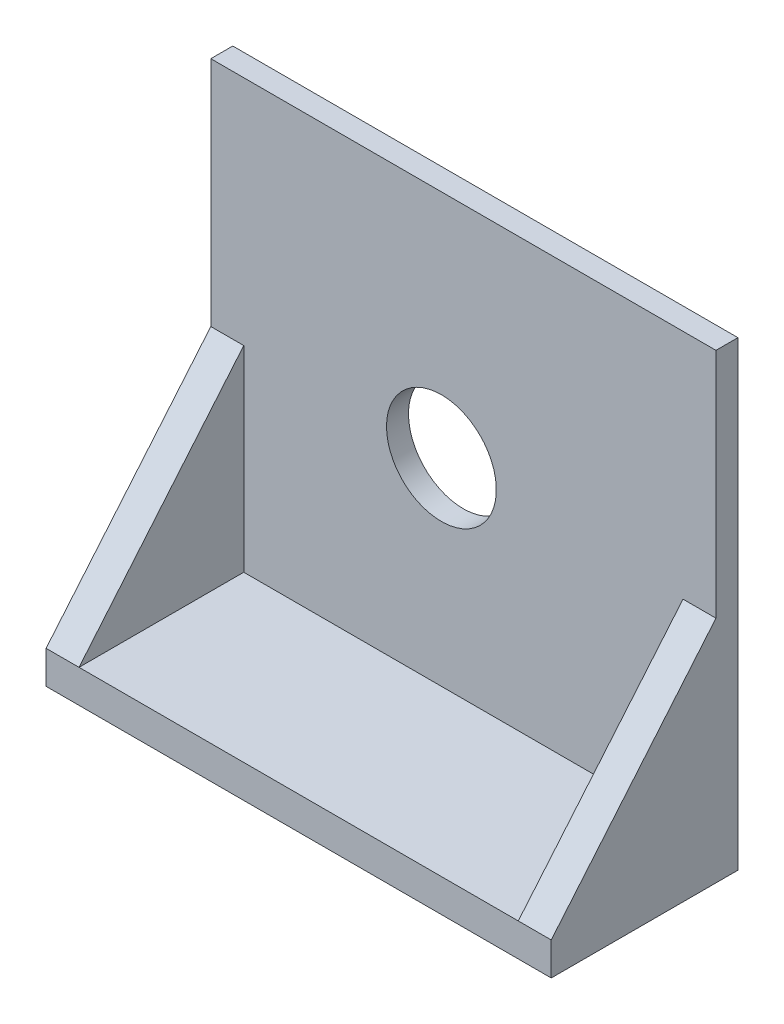
ISO-10303-21;
HEADER;
FILE_DESCRIPTION(('STEP AP214'),'2;1');
FILE_NAME('part.step','',(''),(''),'','','');
FILE_SCHEMA(('AUTOMOTIVE_DESIGN { 1 0 10303 214 1 1 1 1 }'));
ENDSEC;
DATA;
#1=APPLICATION_CONTEXT('core data for automotive mechanical design processes');
#2=APPLICATION_PROTOCOL_DEFINITION('international standard','automotive_design',2000,#1);
#3=PRODUCT_CONTEXT('',#1,'mechanical');
#4=PRODUCT('Part','Part','',(#3));
#5=PRODUCT_RELATED_PRODUCT_CATEGORY('part','',(#4));
#6=PRODUCT_DEFINITION_FORMATION('','',#4);
#7=PRODUCT_DEFINITION_CONTEXT('part definition',#1,'design');
#8=PRODUCT_DEFINITION('design','',#6,#7);
#9=PRODUCT_DEFINITION_SHAPE('','',#8);
#10=(LENGTH_UNIT() NAMED_UNIT(*) SI_UNIT(.MILLI.,.METRE.));
#11=(NAMED_UNIT(*) PLANE_ANGLE_UNIT() SI_UNIT($,.RADIAN.));
#12=(NAMED_UNIT(*) SI_UNIT($,.STERADIAN.) SOLID_ANGLE_UNIT());
#13=UNCERTAINTY_MEASURE_WITH_UNIT(LENGTH_MEASURE(1.E-05),#10,'distance_accuracy_value','');
#14=(GEOMETRIC_REPRESENTATION_CONTEXT(3) GLOBAL_UNCERTAINTY_ASSIGNED_CONTEXT((#13)) GLOBAL_UNIT_ASSIGNED_CONTEXT((#10,
#11,#12)) REPRESENTATION_CONTEXT('',''));
#15=CARTESIAN_POINT('',(0.,0.,0.));
#16=DIRECTION('',(0.,0.,1.));
#17=DIRECTION('',(1.,0.,0.));
#18=AXIS2_PLACEMENT_3D('',#15,#16,#17);
#19=CARTESIAN_POINT('',(0.,-39.,17.));
#20=DIRECTION('',(0.,-1.,0.));
#21=DIRECTION('',(0.,0.,-1.));
#22=AXIS2_PLACEMENT_3D('',#19,#20,#21);
#23=PLANE('',#22);
#24=DIRECTION('',(0.,0.,-1.));
#25=VECTOR('',#24,1.);
#26=CARTESIAN_POINT('',(43.,-39.,2.));
#27=LINE('',#26,#25);
#28=CARTESIAN_POINT('',(43.,-39.,17.));
#29=VERTEX_POINT('',#28);
#30=CARTESIAN_POINT('',(43.,-39.,2.));
#31=VERTEX_POINT('',#30);
#32=EDGE_CURVE('E230',#29,#31,#27,.T.);
#33=ORIENTED_EDGE('',*,*,#32,.T.);
#34=DIRECTION('',(-1.,0.,0.));
#35=VECTOR('',#34,1.);
#36=CARTESIAN_POINT('',(0.,-39.,2.));
#37=LINE('',#36,#35);
#38=CARTESIAN_POINT('',(3.,-39.,2.));
#39=VERTEX_POINT('',#38);
#40=EDGE_CURVE('E135',#31,#39,#37,.T.);
#41=ORIENTED_EDGE('',*,*,#40,.T.);
#42=DIRECTION('',(0.,0.,1.));
#43=VECTOR('',#42,1.);
#44=CARTESIAN_POINT('',(3.,-39.,17.));
#45=LINE('',#44,#43);
#46=CARTESIAN_POINT('',(3.,-39.,17.));
#47=VERTEX_POINT('',#46);
#48=EDGE_CURVE('E186',#39,#47,#45,.T.);
#49=ORIENTED_EDGE('',*,*,#48,.T.);
#50=DIRECTION('',(-1.,0.,0.));
#51=VECTOR('',#50,1.);
#52=CARTESIAN_POINT('',(0.,-39.,17.));
#53=LINE('',#52,#51);
#54=EDGE_CURVE('E103',#29,#47,#53,.T.);
#55=ORIENTED_EDGE('',*,*,#54,.F.);
#56=EDGE_LOOP('',(#33,#41,#49,#55));
#57=FACE_BOUND('',#56,.T.);
#58=ADVANCED_FACE('F35',(#57),#23,.F.);
#59=CARTESIAN_POINT('',(0.,0.,2.));
#60=DIRECTION('',(1.,0.,0.));
#61=DIRECTION('',(0.,1.,0.));
#62=AXIS2_PLACEMENT_3D('',#59,#60,#61);
#63=PLANE('',#62);
#64=DIRECTION('',(0.,-1.,0.));
#65=VECTOR('',#64,1.);
#66=CARTESIAN_POINT('',(0.,0.,0.));
#67=LINE('',#66,#65);
#68=CARTESIAN_POINT('',(0.,0.,0.));
#69=VERTEX_POINT('',#68);
#70=CARTESIAN_POINT('',(0.,-42.,0.));
#71=VERTEX_POINT('',#70);
#72=EDGE_CURVE('E94',#69,#71,#67,.T.);
#73=ORIENTED_EDGE('',*,*,#72,.T.);
#74=DIRECTION('',(0.,0.,-1.));
#75=VECTOR('',#74,1.);
#76=CARTESIAN_POINT('',(0.,-42.,2.));
#77=LINE('',#76,#75);
#78=CARTESIAN_POINT('',(0.,-42.,17.));
#79=VERTEX_POINT('',#78);
#80=EDGE_CURVE('E11',#79,#71,#77,.T.);
#81=ORIENTED_EDGE('',*,*,#80,.F.);
#82=DIRECTION('',(0.,-1.,0.));
#83=VECTOR('',#82,1.);
#84=CARTESIAN_POINT('',(0.,-42.,17.));
#85=LINE('',#84,#83);
#86=CARTESIAN_POINT('',(0.,-39.,17.));
#87=VERTEX_POINT('',#86);
#88=EDGE_CURVE('E132',#87,#79,#85,.T.);
#89=ORIENTED_EDGE('',*,*,#88,.F.);
#90=DIRECTION('',(0.,0.76604444311898,-0.642787609686538));
#91=VECTOR('',#90,1.);
#92=CARTESIAN_POINT('',(0.,-39.,17.));
#93=LINE('',#92,#91);
#94=CARTESIAN_POINT('',(0.,-21.1236961110868,2.));
#95=VERTEX_POINT('',#94);
#96=EDGE_CURVE('E172',#87,#95,#93,.T.);
#97=ORIENTED_EDGE('',*,*,#96,.T.);
#98=DIRECTION('',(0.,-1.,0.));
#99=VECTOR('',#98,1.);
#100=CARTESIAN_POINT('',(0.,0.,2.));
#101=LINE('',#100,#99);
#102=CARTESIAN_POINT('',(0.,0.,2.));
#103=VERTEX_POINT('',#102);
#104=EDGE_CURVE('E88',#103,#95,#101,.T.);
#105=ORIENTED_EDGE('',*,*,#104,.F.);
#106=DIRECTION('',(0.,0.,-1.));
#107=VECTOR('',#106,1.);
#108=CARTESIAN_POINT('',(0.,0.,2.));
#109=LINE('',#108,#107);
#110=EDGE_CURVE('E81',#103,#69,#109,.T.);
#111=ORIENTED_EDGE('',*,*,#110,.T.);
#112=EDGE_LOOP('',(#73,#81,#89,#97,#105,#111));
#113=FACE_BOUND('',#112,.T.);
#114=ADVANCED_FACE('F37',(#113),#63,.F.);
#115=CARTESIAN_POINT('',(0.,-42.,2.));
#116=DIRECTION('',(0.,1.,0.));
#117=DIRECTION('',(0.,0.,1.));
#118=AXIS2_PLACEMENT_3D('',#115,#116,#117);
#119=PLANE('',#118);
#120=DIRECTION('',(1.,0.,0.));
#121=VECTOR('',#120,1.);
#122=CARTESIAN_POINT('',(0.,-42.,0.));
#123=LINE('',#122,#121);
#124=CARTESIAN_POINT('',(46.,-42.,0.));
#125=VERTEX_POINT('',#124);
#126=EDGE_CURVE('E98',#71,#125,#123,.T.);
#127=ORIENTED_EDGE('',*,*,#126,.T.);
#128=DIRECTION('',(0.,0.,-1.));
#129=VECTOR('',#128,1.);
#130=CARTESIAN_POINT('',(46.,-42.,2.));
#131=LINE('',#130,#129);
#132=CARTESIAN_POINT('',(46.,-42.,17.));
#133=VERTEX_POINT('',#132);
#134=EDGE_CURVE('E43',#133,#125,#131,.T.);
#135=ORIENTED_EDGE('',*,*,#134,.F.);
#136=DIRECTION('',(1.,0.,0.));
#137=VECTOR('',#136,1.);
#138=CARTESIAN_POINT('',(0.,-42.,17.));
#139=LINE('',#138,#137);
#140=EDGE_CURVE('E124',#79,#133,#139,.T.);
#141=ORIENTED_EDGE('',*,*,#140,.F.);
#142=ORIENTED_EDGE('',*,*,#80,.T.);
#143=EDGE_LOOP('',(#127,#135,#141,#142));
#144=FACE_BOUND('',#143,.T.);
#145=ADVANCED_FACE('F122',(#144),#119,.F.);
#146=CARTESIAN_POINT('',(46.,0.,2.));
#147=DIRECTION('',(-1.,0.,0.));
#148=DIRECTION('',(0.,-1.,0.));
#149=AXIS2_PLACEMENT_3D('',#146,#147,#148);
#150=PLANE('',#149);
#151=DIRECTION('',(0.,1.,0.));
#152=VECTOR('',#151,1.);
#153=CARTESIAN_POINT('',(46.,0.,2.));
#154=LINE('',#153,#152);
#155=CARTESIAN_POINT('',(46.,-21.1236961110868,2.));
#156=VERTEX_POINT('',#155);
#157=CARTESIAN_POINT('',(46.,0.,2.));
#158=VERTEX_POINT('',#157);
#159=EDGE_CURVE('E142',#156,#158,#154,.T.);
#160=ORIENTED_EDGE('',*,*,#159,.F.);
#161=DIRECTION('',(0.,-0.76604444311898,0.642787609686538));
#162=VECTOR('',#161,1.);
#163=CARTESIAN_POINT('',(46.,-39.,17.));
#164=LINE('',#163,#162);
#165=CARTESIAN_POINT('',(46.,-39.,17.));
#166=VERTEX_POINT('',#165);
#167=EDGE_CURVE('E150',#156,#166,#164,.T.);
#168=ORIENTED_EDGE('',*,*,#167,.T.);
#169=DIRECTION('',(0.,1.,0.));
#170=VECTOR('',#169,1.);
#171=CARTESIAN_POINT('',(46.,-42.,17.));
#172=LINE('',#171,#170);
#173=EDGE_CURVE('E118',#133,#166,#172,.T.);
#174=ORIENTED_EDGE('',*,*,#173,.F.);
#175=ORIENTED_EDGE('',*,*,#134,.T.);
#176=DIRECTION('',(0.,1.,0.));
#177=VECTOR('',#176,1.);
#178=CARTESIAN_POINT('',(46.,0.,0.));
#179=LINE('',#178,#177);
#180=CARTESIAN_POINT('',(46.,0.,0.));
#181=VERTEX_POINT('',#180);
#182=EDGE_CURVE('E89',#125,#181,#179,.T.);
#183=ORIENTED_EDGE('',*,*,#182,.T.);
#184=DIRECTION('',(0.,0.,-1.));
#185=VECTOR('',#184,1.);
#186=CARTESIAN_POINT('',(46.,0.,2.));
#187=LINE('',#186,#185);
#188=EDGE_CURVE('E84',#158,#181,#187,.T.);
#189=ORIENTED_EDGE('',*,*,#188,.F.);
#190=EDGE_LOOP('',(#160,#168,#174,#175,#183,#189));
#191=FACE_BOUND('',#190,.T.);
#192=ADVANCED_FACE('F114',(#191),#150,.F.);
#193=CARTESIAN_POINT('',(0.,0.,2.));
#194=DIRECTION('',(0.,-1.,0.));
#195=DIRECTION('',(0.,0.,-1.));
#196=AXIS2_PLACEMENT_3D('',#193,#194,#195);
#197=PLANE('',#196);
#198=DIRECTION('',(-1.,0.,0.));
#199=VECTOR('',#198,1.);
#200=CARTESIAN_POINT('',(0.,0.,0.));
#201=LINE('',#200,#199);
#202=EDGE_CURVE('E78',#181,#69,#201,.T.);
#203=ORIENTED_EDGE('',*,*,#202,.T.);
#204=ORIENTED_EDGE('',*,*,#110,.F.);
#205=DIRECTION('',(-1.,0.,0.));
#206=VECTOR('',#205,1.);
#207=CARTESIAN_POINT('',(0.,0.,2.));
#208=LINE('',#207,#206);
#209=EDGE_CURVE('E59',#158,#103,#208,.T.);
#210=ORIENTED_EDGE('',*,*,#209,.F.);
#211=ORIENTED_EDGE('',*,*,#188,.T.);
#212=EDGE_LOOP('',(#203,#204,#210,#211));
#213=FACE_BOUND('',#212,.T.);
#214=ADVANCED_FACE('F80',(#213),#197,.F.);
#215=CARTESIAN_POINT('',(0.,0.,2.));
#216=DIRECTION('',(0.,0.,1.));
#217=DIRECTION('',(1.,0.,0.));
#218=AXIS2_PLACEMENT_3D('',#215,#216,#217);
#219=PLANE('',#218);
#220=DIRECTION('',(1.,0.,0.));
#221=VECTOR('',#220,1.);
#222=CARTESIAN_POINT('',(43.,-21.1236961110868,2.));
#223=LINE('',#222,#221);
#224=CARTESIAN_POINT('',(43.,-21.1236961110868,2.));
#225=VERTEX_POINT('',#224);
#226=EDGE_CURVE('E148',#225,#156,#223,.T.);
#227=ORIENTED_EDGE('',*,*,#226,.T.);
#228=ORIENTED_EDGE('',*,*,#159,.T.);
#229=ORIENTED_EDGE('',*,*,#209,.T.);
#230=ORIENTED_EDGE('',*,*,#104,.T.);
#231=DIRECTION('',(-1.,0.,0.));
#232=VECTOR('',#231,1.);
#233=CARTESIAN_POINT('',(3.,-21.1236961110868,2.));
#234=LINE('',#233,#232);
#235=CARTESIAN_POINT('',(3.,-21.1236961110868,2.));
#236=VERTEX_POINT('',#235);
#237=EDGE_CURVE('E178',#236,#95,#234,.T.);
#238=ORIENTED_EDGE('',*,*,#237,.F.);
#239=DIRECTION('',(0.,-1.,0.));
#240=VECTOR('',#239,1.);
#241=CARTESIAN_POINT('',(3.,-21.1236961110868,2.));
#242=LINE('',#241,#240);
#243=EDGE_CURVE('E179',#236,#39,#242,.T.);
#244=ORIENTED_EDGE('',*,*,#243,.T.);
#245=ORIENTED_EDGE('',*,*,#40,.F.);
#246=DIRECTION('',(0.,1.,0.));
#247=VECTOR('',#246,1.);
#248=CARTESIAN_POINT('',(43.,-21.1236961110868,2.));
#249=LINE('',#248,#247);
#250=EDGE_CURVE('E231',#31,#225,#249,.T.);
#251=ORIENTED_EDGE('',*,*,#250,.T.);
#252=EDGE_LOOP('',(#227,#228,#229,#230,#238,#244,#245,#251));
#253=FACE_BOUND('',#252,.T.);
#254=CARTESIAN_POINT('',(21.,-21.,2.));
#255=DIRECTION('',(0.,0.,-1.));
#256=DIRECTION('',(-1.,0.,0.));
#257=AXIS2_PLACEMENT_3D('',#254,#255,#256);
#258=CIRCLE('',#257,5.);
#259=CARTESIAN_POINT('',(16.,-21.,2.));
#260=VERTEX_POINT('',#259);
#261=EDGE_CURVE('E141',#260,#260,#258,.T.);
#262=ORIENTED_EDGE('',*,*,#261,.T.);
#263=EDGE_LOOP('',(#262));
#264=FACE_BOUND('',#263,.T.);
#265=ADVANCED_FACE('F144',(#253,#264),#219,.T.);
#266=CARTESIAN_POINT('',(0.,0.,0.));
#267=DIRECTION('',(0.,0.,1.));
#268=DIRECTION('',(1.,0.,0.));
#269=AXIS2_PLACEMENT_3D('',#266,#267,#268);
#270=PLANE('',#269);
#271=CARTESIAN_POINT('',(21.,-21.,0.));
#272=DIRECTION('',(0.,0.,-1.));
#273=DIRECTION('',(-1.,0.,0.));
#274=AXIS2_PLACEMENT_3D('',#271,#272,#273);
#275=CIRCLE('',#274,5.);
#276=CARTESIAN_POINT('',(16.,-21.,0.));
#277=VERTEX_POINT('',#276);
#278=EDGE_CURVE('E184',#277,#277,#275,.T.);
#279=ORIENTED_EDGE('',*,*,#278,.F.);
#280=EDGE_LOOP('',(#279));
#281=FACE_BOUND('',#280,.T.);
#282=ORIENTED_EDGE('',*,*,#72,.F.);
#283=ORIENTED_EDGE('',*,*,#202,.F.);
#284=ORIENTED_EDGE('',*,*,#182,.F.);
#285=ORIENTED_EDGE('',*,*,#126,.F.);
#286=EDGE_LOOP('',(#282,#283,#284,#285));
#287=FACE_BOUND('',#286,.T.);
#288=ADVANCED_FACE('F97',(#281,#287),#270,.F.);
#289=CARTESIAN_POINT('',(0.,0.,17.));
#290=DIRECTION('',(0.,0.,-1.));
#291=DIRECTION('',(-1.,0.,0.));
#292=AXIS2_PLACEMENT_3D('',#289,#290,#291);
#293=PLANE('',#292);
#294=ORIENTED_EDGE('',*,*,#88,.T.);
#295=ORIENTED_EDGE('',*,*,#140,.T.);
#296=ORIENTED_EDGE('',*,*,#173,.T.);
#297=EDGE_CURVE('E99',#166,#29,#53,.T.);
#298=ORIENTED_EDGE('',*,*,#297,.T.);
#299=ORIENTED_EDGE('',*,*,#54,.T.);
#300=DIRECTION('',(-1.,0.,0.));
#301=VECTOR('',#300,1.);
#302=CARTESIAN_POINT('',(3.,-39.,17.));
#303=LINE('',#302,#301);
#304=EDGE_CURVE('E175',#47,#87,#303,.T.);
#305=ORIENTED_EDGE('',*,*,#304,.T.);
#306=EDGE_LOOP('',(#294,#295,#296,#298,#299,#305));
#307=FACE_BOUND('',#306,.T.);
#308=ADVANCED_FACE('F128',(#307),#293,.F.);
#309=CARTESIAN_POINT('',(21.,-21.,2.));
#310=DIRECTION('',(0.,0.,-1.));
#311=DIRECTION('',(-1.,0.,0.));
#312=AXIS2_PLACEMENT_3D('',#309,#310,#311);
#313=CYLINDRICAL_SURFACE('',#312,5.);
#314=ORIENTED_EDGE('',*,*,#261,.F.);
#315=EDGE_LOOP('',(#314));
#316=FACE_BOUND('',#315,.T.);
#317=ORIENTED_EDGE('',*,*,#278,.T.);
#318=EDGE_LOOP('',(#317));
#319=FACE_BOUND('',#318,.T.);
#320=ADVANCED_FACE('F193',(#316,#319),#313,.F.);
#321=CARTESIAN_POINT('',(3.,-39.,17.));
#322=DIRECTION('',(0.,0.642787609686537,0.76604444311898));
#323=DIRECTION('',(0.,-0.76604444311898,0.642787609686537));
#324=AXIS2_PLACEMENT_3D('',#321,#322,#323);
#325=PLANE('',#324);
#326=ORIENTED_EDGE('',*,*,#96,.F.);
#327=ORIENTED_EDGE('',*,*,#304,.F.);
#328=DIRECTION('',(0.,0.76604444311898,-0.642787609686538));
#329=VECTOR('',#328,1.);
#330=CARTESIAN_POINT('',(3.,-39.,17.));
#331=LINE('',#330,#329);
#332=EDGE_CURVE('E182',#47,#236,#331,.T.);
#333=ORIENTED_EDGE('',*,*,#332,.T.);
#334=ORIENTED_EDGE('',*,*,#237,.T.);
#335=EDGE_LOOP('',(#326,#327,#333,#334));
#336=FACE_BOUND('',#335,.T.);
#337=ADVANCED_FACE('F173',(#336),#325,.T.);
#338=CARTESIAN_POINT('',(3.,0.,0.));
#339=DIRECTION('',(1.,0.,0.));
#340=DIRECTION('',(0.,1.,0.));
#341=AXIS2_PLACEMENT_3D('',#338,#339,#340);
#342=PLANE('',#341);
#343=ORIENTED_EDGE('',*,*,#243,.F.);
#344=ORIENTED_EDGE('',*,*,#332,.F.);
#345=ORIENTED_EDGE('',*,*,#48,.F.);
#346=EDGE_LOOP('',(#343,#344,#345));
#347=FACE_BOUND('',#346,.T.);
#348=ADVANCED_FACE('F217',(#347),#342,.T.);
#349=CARTESIAN_POINT('',(43.,-39.,17.));
#350=DIRECTION('',(0.,0.642787609686537,0.76604444311898));
#351=DIRECTION('',(0.,-0.76604444311898,0.642787609686537));
#352=AXIS2_PLACEMENT_3D('',#349,#350,#351);
#353=PLANE('',#352);
#354=ORIENTED_EDGE('',*,*,#167,.F.);
#355=ORIENTED_EDGE('',*,*,#226,.F.);
#356=DIRECTION('',(0.,-0.76604444311898,0.642787609686538));
#357=VECTOR('',#356,1.);
#358=CARTESIAN_POINT('',(43.,-39.,17.));
#359=LINE('',#358,#357);
#360=EDGE_CURVE('E50',#225,#29,#359,.T.);
#361=ORIENTED_EDGE('',*,*,#360,.T.);
#362=ORIENTED_EDGE('',*,*,#297,.F.);
#363=EDGE_LOOP('',(#354,#355,#361,#362));
#364=FACE_BOUND('',#363,.T.);
#365=ADVANCED_FACE('F220',(#364),#353,.T.);
#366=CARTESIAN_POINT('',(43.,0.,0.));
#367=DIRECTION('',(1.,0.,0.));
#368=DIRECTION('',(0.,0.,-1.));
#369=AXIS2_PLACEMENT_3D('',#366,#367,#368);
#370=PLANE('',#369);
#371=ORIENTED_EDGE('',*,*,#32,.F.);
#372=ORIENTED_EDGE('',*,*,#360,.F.);
#373=ORIENTED_EDGE('',*,*,#250,.F.);
#374=EDGE_LOOP('',(#371,#372,#373));
#375=FACE_BOUND('',#374,.T.);
#376=ADVANCED_FACE('F224',(#375),#370,.F.);
#377=CLOSED_SHELL('',(#58,#114,#145,#192,#214,#265,#288,#308,#320,#337,#348,#365,#376));
#378=MANIFOLD_SOLID_BREP('B2',#377);
#379=ADVANCED_BREP_SHAPE_REPRESENTATION('',(#18,#378),#14);
#380=SHAPE_DEFINITION_REPRESENTATION(#9,#379);
ENDSEC;
END-ISO-10303-21;
